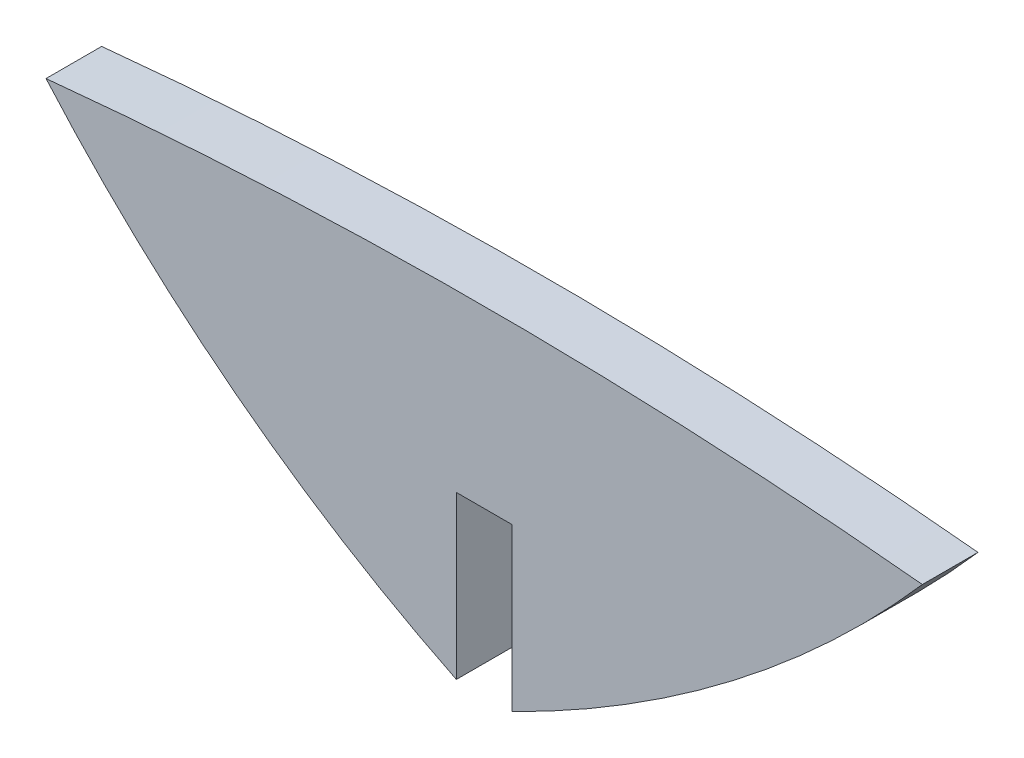
ISO-10303-21;
HEADER;
FILE_DESCRIPTION(('STEP AP214'),'2;1');
FILE_NAME('part.step','',(''),(''),'','','');
FILE_SCHEMA(('AUTOMOTIVE_DESIGN { 1 0 10303 214 1 1 1 1 }'));
ENDSEC;
DATA;
#1=APPLICATION_CONTEXT('core data for automotive mechanical design processes');
#2=APPLICATION_PROTOCOL_DEFINITION('international standard','automotive_design',2000,#1);
#3=PRODUCT_CONTEXT('',#1,'mechanical');
#4=PRODUCT('Part','Part','',(#3));
#5=PRODUCT_RELATED_PRODUCT_CATEGORY('part','',(#4));
#6=PRODUCT_DEFINITION_FORMATION('','',#4);
#7=PRODUCT_DEFINITION_CONTEXT('part definition',#1,'design');
#8=PRODUCT_DEFINITION('design','',#6,#7);
#9=PRODUCT_DEFINITION_SHAPE('','',#8);
#10=(LENGTH_UNIT() NAMED_UNIT(*) SI_UNIT(.MILLI.,.METRE.));
#11=(NAMED_UNIT(*) PLANE_ANGLE_UNIT() SI_UNIT($,.RADIAN.));
#12=(NAMED_UNIT(*) SI_UNIT($,.STERADIAN.) SOLID_ANGLE_UNIT());
#13=UNCERTAINTY_MEASURE_WITH_UNIT(LENGTH_MEASURE(1.E-05),#10,'distance_accuracy_value','');
#14=(GEOMETRIC_REPRESENTATION_CONTEXT(3) GLOBAL_UNCERTAINTY_ASSIGNED_CONTEXT((#13)) GLOBAL_UNIT_ASSIGNED_CONTEXT((#10,
#11,#12)) REPRESENTATION_CONTEXT('',''));
#15=CARTESIAN_POINT('',(0.,0.,0.));
#16=DIRECTION('',(0.,0.,1.));
#17=DIRECTION('',(1.,0.,0.));
#18=AXIS2_PLACEMENT_3D('',#15,#16,#17);
#19=CARTESIAN_POINT('',(-31.5029923507927,405.72790047347,3.1749999999991));
#20=DIRECTION('',(0.,0.,-1.));
#21=DIRECTION('',(-1.,0.,0.));
#22=AXIS2_PLACEMENT_3D('',#19,#20,#21);
#23=CYLINDRICAL_SURFACE('',#22,75.);
#24=CARTESIAN_POINT('',(-31.5029923507927,405.72790047347,-9.00755164900957E-13));
#25=DIRECTION('',(0.,0.,1.));
#26=DIRECTION('',(1.,0.,0.));
#27=AXIS2_PLACEMENT_3D('',#24,#25,#26);
#28=CIRCLE('',#27,75.);
#29=CARTESIAN_POINT('',(1.5875,338.42248229646,-9.00755164900957E-13));
#30=VERTEX_POINT('',#29);
#31=CARTESIAN_POINT('',(25.,356.40841289091,-9.00755164900957E-13));
#32=VERTEX_POINT('',#31);
#33=EDGE_CURVE('E120',#30,#32,#28,.T.);
#34=ORIENTED_EDGE('',*,*,#33,.T.);
#35=DIRECTION('',(0.,0.,-1.));
#36=VECTOR('',#35,1.);
#37=CARTESIAN_POINT('',(25.,356.40841289091,3.1749999999991));
#38=LINE('',#37,#36);
#39=CARTESIAN_POINT('',(25.,356.40841289091,3.1749999999991));
#40=VERTEX_POINT('',#39);
#41=EDGE_CURVE('E11',#40,#32,#38,.T.);
#42=ORIENTED_EDGE('',*,*,#41,.F.);
#43=CARTESIAN_POINT('',(-31.5029923507927,405.72790047347,3.1749999999991));
#44=DIRECTION('',(0.,0.,1.));
#45=DIRECTION('',(1.,0.,0.));
#46=AXIS2_PLACEMENT_3D('',#43,#44,#45);
#47=CIRCLE('',#46,75.);
#48=CARTESIAN_POINT('',(1.5875,338.42248229646,3.1749999999991));
#49=VERTEX_POINT('',#48);
#50=EDGE_CURVE('E132',#49,#40,#47,.T.);
#51=ORIENTED_EDGE('',*,*,#50,.F.);
#52=DIRECTION('',(0.,0.,-1.));
#53=VECTOR('',#52,1.);
#54=CARTESIAN_POINT('',(1.5875,338.42248229646,3.1749999999991));
#55=LINE('',#54,#53);
#56=EDGE_CURVE('E51',#49,#30,#55,.T.);
#57=ORIENTED_EDGE('',*,*,#56,.T.);
#58=EDGE_LOOP('',(#34,#42,#51,#57));
#59=FACE_BOUND('',#58,.T.);
#60=ADVANCED_FACE('F35',(#59),#23,.T.);
#61=CARTESIAN_POINT('',(0.,107.339977578946,3.1749999999991));
#62=DIRECTION('',(0.,0.,-1.));
#63=DIRECTION('',(-1.,0.,0.));
#64=AXIS2_PLACEMENT_3D('',#61,#62,#63);
#65=CYLINDRICAL_SURFACE('',#64,250.319966180786);
#66=CARTESIAN_POINT('',(0.,107.339977578946,-9.00755164900957E-13));
#67=DIRECTION('',(0.,0.,1.));
#68=DIRECTION('',(1.,0.,0.));
#69=AXIS2_PLACEMENT_3D('',#66,#67,#68);
#70=CIRCLE('',#69,250.319966180786);
#71=CARTESIAN_POINT('',(-25.,356.40841289091,-9.00755164900957E-13));
#72=VERTEX_POINT('',#71);
#73=EDGE_CURVE('E122',#32,#72,#70,.T.);
#74=ORIENTED_EDGE('',*,*,#73,.T.);
#75=DIRECTION('',(0.,0.,-1.));
#76=VECTOR('',#75,1.);
#77=CARTESIAN_POINT('',(-25.,356.40841289091,3.1749999999991));
#78=LINE('',#77,#76);
#79=CARTESIAN_POINT('',(-25.,356.40841289091,3.1749999999991));
#80=VERTEX_POINT('',#79);
#81=EDGE_CURVE('E43',#80,#72,#78,.T.);
#82=ORIENTED_EDGE('',*,*,#81,.F.);
#83=CARTESIAN_POINT('',(0.,107.339977578946,3.1749999999991));
#84=DIRECTION('',(0.,0.,1.));
#85=DIRECTION('',(1.,0.,0.));
#86=AXIS2_PLACEMENT_3D('',#83,#84,#85);
#87=CIRCLE('',#86,250.319966180786);
#88=EDGE_CURVE('E84',#40,#80,#87,.T.);
#89=ORIENTED_EDGE('',*,*,#88,.F.);
#90=ORIENTED_EDGE('',*,*,#41,.T.);
#91=EDGE_LOOP('',(#74,#82,#89,#90));
#92=FACE_BOUND('',#91,.T.);
#93=ADVANCED_FACE('F152',(#92),#65,.T.);
#94=CARTESIAN_POINT('',(31.5029923507927,405.72790047347,3.1749999999991));
#95=DIRECTION('',(0.,0.,-1.));
#96=DIRECTION('',(-1.,0.,0.));
#97=AXIS2_PLACEMENT_3D('',#94,#95,#96);
#98=CYLINDRICAL_SURFACE('',#97,75.);
#99=CARTESIAN_POINT('',(31.5029923507927,405.72790047347,-9.00755164900957E-13));
#100=DIRECTION('',(0.,0.,1.));
#101=DIRECTION('',(1.,0.,0.));
#102=AXIS2_PLACEMENT_3D('',#99,#100,#101);
#103=CIRCLE('',#102,75.);
#104=CARTESIAN_POINT('',(-1.5875,338.42248229646,-9.00755164900957E-13));
#105=VERTEX_POINT('',#104);
#106=EDGE_CURVE('E124',#72,#105,#103,.T.);
#107=ORIENTED_EDGE('',*,*,#106,.T.);
#108=DIRECTION('',(0.,0.,-1.));
#109=VECTOR('',#108,1.);
#110=CARTESIAN_POINT('',(-1.5875,338.42248229646,3.1749999999991));
#111=LINE('',#110,#109);
#112=CARTESIAN_POINT('',(-1.5875,338.42248229646,3.1749999999991));
#113=VERTEX_POINT('',#112);
#114=EDGE_CURVE('E112',#113,#105,#111,.T.);
#115=ORIENTED_EDGE('',*,*,#114,.F.);
#116=CARTESIAN_POINT('',(31.5029923507927,405.72790047347,3.1749999999991));
#117=DIRECTION('',(0.,0.,1.));
#118=DIRECTION('',(1.,0.,0.));
#119=AXIS2_PLACEMENT_3D('',#116,#117,#118);
#120=CIRCLE('',#119,75.);
#121=EDGE_CURVE('E100',#80,#113,#120,.T.);
#122=ORIENTED_EDGE('',*,*,#121,.F.);
#123=ORIENTED_EDGE('',*,*,#81,.T.);
#124=EDGE_LOOP('',(#107,#115,#122,#123));
#125=FACE_BOUND('',#124,.T.);
#126=ADVANCED_FACE('F138',(#125),#98,.T.);
#127=CARTESIAN_POINT('',(-1.5875,0.,3.1749999999991));
#128=DIRECTION('',(-1.,0.,0.));
#129=DIRECTION('',(0.,0.,1.));
#130=AXIS2_PLACEMENT_3D('',#127,#128,#129);
#131=PLANE('',#130);
#132=DIRECTION('',(0.,1.,0.));
#133=VECTOR('',#132,1.);
#134=CARTESIAN_POINT('',(-1.5875,0.,-9.00755164900957E-13));
#135=LINE('',#134,#133);
#136=CARTESIAN_POINT('',(-1.5875,347.664977578946,-9.00755164900957E-13));
#137=VERTEX_POINT('',#136);
#138=EDGE_CURVE('E109',#105,#137,#135,.T.);
#139=ORIENTED_EDGE('',*,*,#138,.T.);
#140=DIRECTION('',(0.,0.,-1.));
#141=VECTOR('',#140,1.);
#142=CARTESIAN_POINT('',(-1.5875,347.664977578946,3.1749999999991));
#143=LINE('',#142,#141);
#144=CARTESIAN_POINT('',(-1.5875,347.664977578946,3.1749999999991));
#145=VERTEX_POINT('',#144);
#146=EDGE_CURVE('E106',#145,#137,#143,.T.);
#147=ORIENTED_EDGE('',*,*,#146,.F.);
#148=DIRECTION('',(0.,1.,0.));
#149=VECTOR('',#148,1.);
#150=CARTESIAN_POINT('',(-1.5875,0.,3.1749999999991));
#151=LINE('',#150,#149);
#152=EDGE_CURVE('E93',#113,#145,#151,.T.);
#153=ORIENTED_EDGE('',*,*,#152,.F.);
#154=ORIENTED_EDGE('',*,*,#114,.T.);
#155=EDGE_LOOP('',(#139,#147,#153,#154));
#156=FACE_BOUND('',#155,.T.);
#157=ADVANCED_FACE('F107',(#156),#131,.F.);
#158=CARTESIAN_POINT('',(0.,347.664977578946,3.1749999999991));
#159=DIRECTION('',(0.,1.,0.));
#160=DIRECTION('',(0.,0.,1.));
#161=AXIS2_PLACEMENT_3D('',#158,#159,#160);
#162=PLANE('',#161);
#163=DIRECTION('',(1.,0.,0.));
#164=VECTOR('',#163,1.);
#165=CARTESIAN_POINT('',(0.,347.664977578946,-9.00755164900957E-13));
#166=LINE('',#165,#164);
#167=CARTESIAN_POINT('',(1.5875,347.664977578946,-9.00755164900957E-13));
#168=VERTEX_POINT('',#167);
#169=EDGE_CURVE('E127',#137,#168,#166,.T.);
#170=ORIENTED_EDGE('',*,*,#169,.T.);
#171=DIRECTION('',(0.,0.,-1.));
#172=VECTOR('',#171,1.);
#173=CARTESIAN_POINT('',(1.5875,347.664977578946,3.1749999999991));
#174=LINE('',#173,#172);
#175=CARTESIAN_POINT('',(1.5875,347.664977578946,3.1749999999991));
#176=VERTEX_POINT('',#175);
#177=EDGE_CURVE('E72',#176,#168,#174,.T.);
#178=ORIENTED_EDGE('',*,*,#177,.F.);
#179=DIRECTION('',(1.,0.,0.));
#180=VECTOR('',#179,1.);
#181=CARTESIAN_POINT('',(0.,347.664977578946,3.1749999999991));
#182=LINE('',#181,#180);
#183=EDGE_CURVE('E98',#145,#176,#182,.T.);
#184=ORIENTED_EDGE('',*,*,#183,.F.);
#185=ORIENTED_EDGE('',*,*,#146,.T.);
#186=EDGE_LOOP('',(#170,#178,#184,#185));
#187=FACE_BOUND('',#186,.T.);
#188=ADVANCED_FACE('F114',(#187),#162,.F.);
#189=CARTESIAN_POINT('',(1.5875,0.,3.1749999999991));
#190=DIRECTION('',(-1.,0.,0.));
#191=DIRECTION('',(0.,0.,1.));
#192=AXIS2_PLACEMENT_3D('',#189,#190,#191);
#193=PLANE('',#192);
#194=DIRECTION('',(0.,1.,0.));
#195=VECTOR('',#194,1.);
#196=CARTESIAN_POINT('',(1.5875,0.,-9.00755164900957E-13));
#197=LINE('',#196,#195);
#198=EDGE_CURVE('E129',#30,#168,#197,.T.);
#199=ORIENTED_EDGE('',*,*,#198,.F.);
#200=ORIENTED_EDGE('',*,*,#56,.F.);
#201=DIRECTION('',(0.,1.,0.));
#202=VECTOR('',#201,1.);
#203=CARTESIAN_POINT('',(1.5875,0.,3.1749999999991));
#204=LINE('',#203,#202);
#205=EDGE_CURVE('E115',#49,#176,#204,.T.);
#206=ORIENTED_EDGE('',*,*,#205,.T.);
#207=ORIENTED_EDGE('',*,*,#177,.T.);
#208=EDGE_LOOP('',(#199,#200,#206,#207));
#209=FACE_BOUND('',#208,.T.);
#210=ADVANCED_FACE('F141',(#209),#193,.T.);
#211=CARTESIAN_POINT('',(0.,0.,3.1749999999991));
#212=DIRECTION('',(0.,0.,1.));
#213=DIRECTION('',(1.,0.,0.));
#214=AXIS2_PLACEMENT_3D('',#211,#212,#213);
#215=PLANE('',#214);
#216=ORIENTED_EDGE('',*,*,#50,.T.);
#217=ORIENTED_EDGE('',*,*,#88,.T.);
#218=ORIENTED_EDGE('',*,*,#121,.T.);
#219=ORIENTED_EDGE('',*,*,#152,.T.);
#220=ORIENTED_EDGE('',*,*,#183,.T.);
#221=ORIENTED_EDGE('',*,*,#205,.F.);
#222=EDGE_LOOP('',(#216,#217,#218,#219,#220,#221));
#223=FACE_BOUND('',#222,.T.);
#224=ADVANCED_FACE('F95',(#223),#215,.T.);
#225=CARTESIAN_POINT('',(0.,0.,-9.00755164900957E-13));
#226=DIRECTION('',(0.,0.,1.));
#227=DIRECTION('',(1.,0.,0.));
#228=AXIS2_PLACEMENT_3D('',#225,#226,#227);
#229=PLANE('',#228);
#230=ORIENTED_EDGE('',*,*,#33,.F.);
#231=ORIENTED_EDGE('',*,*,#198,.T.);
#232=ORIENTED_EDGE('',*,*,#169,.F.);
#233=ORIENTED_EDGE('',*,*,#138,.F.);
#234=ORIENTED_EDGE('',*,*,#106,.F.);
#235=ORIENTED_EDGE('',*,*,#73,.F.);
#236=EDGE_LOOP('',(#230,#231,#232,#233,#234,#235));
#237=FACE_BOUND('',#236,.T.);
#238=ADVANCED_FACE('F140',(#237),#229,.F.);
#239=CLOSED_SHELL('',(#60,#93,#126,#157,#188,#210,#224,#238));
#240=MANIFOLD_SOLID_BREP('B2',#239);
#241=ADVANCED_BREP_SHAPE_REPRESENTATION('',(#18,#240),#14);
#242=SHAPE_DEFINITION_REPRESENTATION(#9,#241);
ENDSEC;
END-ISO-10303-21;
